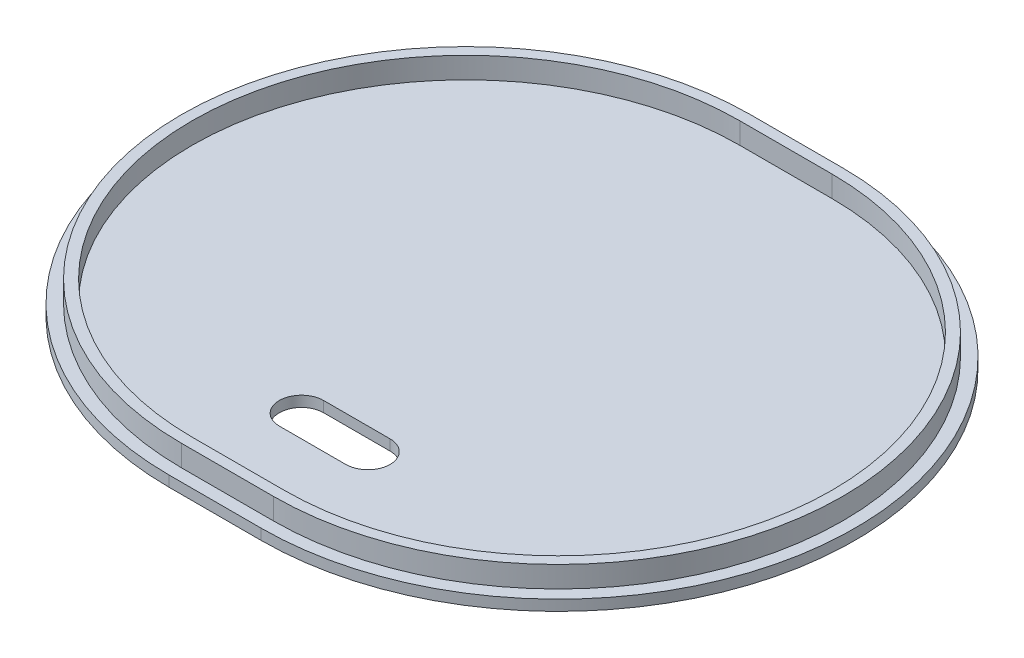
ISO-10303-21;
HEADER;
FILE_DESCRIPTION(('STEP AP214'),'2;1');
FILE_NAME('part.step','',(''),(''),'','','');
FILE_SCHEMA(('AUTOMOTIVE_DESIGN { 1 0 10303 214 1 1 1 1 }'));
ENDSEC;
DATA;
#1=APPLICATION_CONTEXT('core data for automotive mechanical design processes');
#2=APPLICATION_PROTOCOL_DEFINITION('international standard','automotive_design',2000,#1);
#3=PRODUCT_CONTEXT('',#1,'mechanical');
#4=PRODUCT('Part','Part','',(#3));
#5=PRODUCT_RELATED_PRODUCT_CATEGORY('part','',(#4));
#6=PRODUCT_DEFINITION_FORMATION('','',#4);
#7=PRODUCT_DEFINITION_CONTEXT('part definition',#1,'design');
#8=PRODUCT_DEFINITION('design','',#6,#7);
#9=PRODUCT_DEFINITION_SHAPE('','',#8);
#10=(LENGTH_UNIT() NAMED_UNIT(*) SI_UNIT(.MILLI.,.METRE.));
#11=(NAMED_UNIT(*) PLANE_ANGLE_UNIT() SI_UNIT($,.RADIAN.));
#12=(NAMED_UNIT(*) SI_UNIT($,.STERADIAN.) SOLID_ANGLE_UNIT());
#13=UNCERTAINTY_MEASURE_WITH_UNIT(LENGTH_MEASURE(1.E-05),#10,'distance_accuracy_value','');
#14=(GEOMETRIC_REPRESENTATION_CONTEXT(3) GLOBAL_UNCERTAINTY_ASSIGNED_CONTEXT((#13)) GLOBAL_UNIT_ASSIGNED_CONTEXT((#10,
#11,#12)) REPRESENTATION_CONTEXT('',''));
#15=CARTESIAN_POINT('',(0.,0.,0.));
#16=DIRECTION('',(0.,0.,1.));
#17=DIRECTION('',(1.,0.,0.));
#18=AXIS2_PLACEMENT_3D('',#15,#16,#17);
#19=CARTESIAN_POINT('',(10.4,2.4,0.));
#20=DIRECTION('',(0.,1.,0.));
#21=DIRECTION('',(0.,0.,1.));
#22=AXIS2_PLACEMENT_3D('',#19,#20,#21);
#23=PLANE('',#22);
#24=CARTESIAN_POINT('',(10.4,2.4,0.));
#25=DIRECTION('',(0.,1.,0.));
#26=DIRECTION('',(0.,0.,1.));
#27=AXIS2_PLACEMENT_3D('',#24,#25,#26);
#28=CIRCLE('',#27,67.);
#29=CARTESIAN_POINT('',(10.4,2.4,67.));
#30=VERTEX_POINT('',#29);
#31=CARTESIAN_POINT('',(10.4,2.4,-67.));
#32=VERTEX_POINT('',#31);
#33=EDGE_CURVE('E240',#30,#32,#28,.T.);
#34=ORIENTED_EDGE('',*,*,#33,.T.);
#35=DIRECTION('',(-1.,0.,0.));
#36=VECTOR('',#35,1.);
#37=CARTESIAN_POINT('',(-10.4,2.4,-66.9999999999999));
#38=LINE('',#37,#36);
#39=CARTESIAN_POINT('',(-10.4,2.4,-66.9999999999999));
#40=VERTEX_POINT('',#39);
#41=EDGE_CURVE('E243',#32,#40,#38,.T.);
#42=ORIENTED_EDGE('',*,*,#41,.T.);
#43=CARTESIAN_POINT('',(-10.4,2.4,0.));
#44=DIRECTION('',(0.,1.,0.));
#45=DIRECTION('',(0.,0.,-1.));
#46=AXIS2_PLACEMENT_3D('',#43,#44,#45);
#47=CIRCLE('',#46,66.9999999999999);
#48=CARTESIAN_POINT('',(-10.4,2.4,66.9999999999999));
#49=VERTEX_POINT('',#48);
#50=EDGE_CURVE('E246',#40,#49,#47,.T.);
#51=ORIENTED_EDGE('',*,*,#50,.T.);
#52=DIRECTION('',(1.,0.,0.));
#53=VECTOR('',#52,1.);
#54=CARTESIAN_POINT('',(-10.4,2.4,66.9999999999999));
#55=LINE('',#54,#53);
#56=EDGE_CURVE('E248',#49,#30,#55,.T.);
#57=ORIENTED_EDGE('',*,*,#56,.T.);
#58=EDGE_LOOP('',(#34,#42,#51,#57));
#59=FACE_BOUND('',#58,.T.);
#60=DIRECTION('',(1.,0.,0.));
#61=VECTOR('',#60,1.);
#62=CARTESIAN_POINT('',(-10.4,2.4,64.1999999999999));
#63=LINE('',#62,#61);
#64=CARTESIAN_POINT('',(-10.4,2.4,64.1999999999999));
#65=VERTEX_POINT('',#64);
#66=CARTESIAN_POINT('',(10.4,2.4,64.2));
#67=VERTEX_POINT('',#66);
#68=EDGE_CURVE('E224',#65,#67,#63,.T.);
#69=ORIENTED_EDGE('',*,*,#68,.F.);
#70=CARTESIAN_POINT('',(-10.4,2.4,0.));
#71=DIRECTION('',(0.,1.,0.));
#72=DIRECTION('',(0.,0.,-1.));
#73=AXIS2_PLACEMENT_3D('',#70,#71,#72);
#74=CIRCLE('',#73,64.1999999999999);
#75=CARTESIAN_POINT('',(-10.4,2.4,-64.1999999999999));
#76=VERTEX_POINT('',#75);
#77=EDGE_CURVE('E210',#76,#65,#74,.T.);
#78=ORIENTED_EDGE('',*,*,#77,.F.);
#79=DIRECTION('',(-1.,0.,0.));
#80=VECTOR('',#79,1.);
#81=CARTESIAN_POINT('',(-10.4,2.4,-64.1999999999999));
#82=LINE('',#81,#80);
#83=CARTESIAN_POINT('',(10.4,2.4,-64.1999999999999));
#84=VERTEX_POINT('',#83);
#85=EDGE_CURVE('E215',#84,#76,#82,.T.);
#86=ORIENTED_EDGE('',*,*,#85,.F.);
#87=CARTESIAN_POINT('',(10.4,2.4,0.));
#88=DIRECTION('',(0.,1.,0.));
#89=DIRECTION('',(0.,0.,1.));
#90=AXIS2_PLACEMENT_3D('',#87,#88,#89);
#91=CIRCLE('',#90,64.2);
#92=EDGE_CURVE('E226',#67,#84,#91,.T.);
#93=ORIENTED_EDGE('',*,*,#92,.F.);
#94=EDGE_LOOP('',(#69,#78,#86,#93));
#95=FACE_BOUND('',#94,.T.);
#96=ADVANCED_FACE('F32',(#59,#95),#23,.T.);
#97=CARTESIAN_POINT('',(10.4,2.4,0.));
#98=DIRECTION('',(0.,-1.,0.));
#99=DIRECTION('',(0.,0.,-1.));
#100=AXIS2_PLACEMENT_3D('',#97,#98,#99);
#101=CYLINDRICAL_SURFACE('',#100,67.);
#102=CARTESIAN_POINT('',(10.4,0.,0.));
#103=DIRECTION('',(0.,1.,0.));
#104=DIRECTION('',(0.,0.,1.));
#105=AXIS2_PLACEMENT_3D('',#102,#103,#104);
#106=CIRCLE('',#105,67.);
#107=CARTESIAN_POINT('',(10.4,0.,67.));
#108=VERTEX_POINT('',#107);
#109=CARTESIAN_POINT('',(10.4,0.,-67.));
#110=VERTEX_POINT('',#109);
#111=EDGE_CURVE('E239',#108,#110,#106,.T.);
#112=ORIENTED_EDGE('',*,*,#111,.T.);
#113=DIRECTION('',(0.,-1.,0.));
#114=VECTOR('',#113,1.);
#115=CARTESIAN_POINT('',(10.4,2.4,-67.));
#116=LINE('',#115,#114);
#117=EDGE_CURVE('E11',#32,#110,#116,.T.);
#118=ORIENTED_EDGE('',*,*,#117,.F.);
#119=ORIENTED_EDGE('',*,*,#33,.F.);
#120=DIRECTION('',(0.,-1.,0.));
#121=VECTOR('',#120,1.);
#122=CARTESIAN_POINT('',(10.4,2.4,67.));
#123=LINE('',#122,#121);
#124=EDGE_CURVE('E250',#30,#108,#123,.T.);
#125=ORIENTED_EDGE('',*,*,#124,.T.);
#126=EDGE_LOOP('',(#112,#118,#119,#125));
#127=FACE_BOUND('',#126,.T.);
#128=ADVANCED_FACE('F34',(#127),#101,.T.);
#129=CARTESIAN_POINT('',(-10.4,2.4,-66.9999999999999));
#130=DIRECTION('',(0.,0.,1.));
#131=DIRECTION('',(1.,0.,0.));
#132=AXIS2_PLACEMENT_3D('',#129,#130,#131);
#133=PLANE('',#132);
#134=DIRECTION('',(-1.,0.,0.));
#135=VECTOR('',#134,1.);
#136=CARTESIAN_POINT('',(-10.4,0.,-66.9999999999999));
#137=LINE('',#136,#135);
#138=CARTESIAN_POINT('',(-10.4,0.,-66.9999999999999));
#139=VERTEX_POINT('',#138);
#140=EDGE_CURVE('E253',#110,#139,#137,.T.);
#141=ORIENTED_EDGE('',*,*,#140,.T.);
#142=DIRECTION('',(0.,-1.,0.));
#143=VECTOR('',#142,1.);
#144=CARTESIAN_POINT('',(-10.4,2.4,-66.9999999999999));
#145=LINE('',#144,#143);
#146=EDGE_CURVE('E40',#40,#139,#145,.T.);
#147=ORIENTED_EDGE('',*,*,#146,.F.);
#148=ORIENTED_EDGE('',*,*,#41,.F.);
#149=ORIENTED_EDGE('',*,*,#117,.T.);
#150=EDGE_LOOP('',(#141,#147,#148,#149));
#151=FACE_BOUND('',#150,.T.);
#152=ADVANCED_FACE('F281',(#151),#133,.F.);
#153=CARTESIAN_POINT('',(-10.4,2.4,0.));
#154=DIRECTION('',(0.,-1.,0.));
#155=DIRECTION('',(0.,0.,-1.));
#156=AXIS2_PLACEMENT_3D('',#153,#154,#155);
#157=CYLINDRICAL_SURFACE('',#156,66.9999999999999);
#158=CARTESIAN_POINT('',(-10.4,0.,0.));
#159=DIRECTION('',(0.,1.,0.));
#160=DIRECTION('',(0.,0.,-1.));
#161=AXIS2_PLACEMENT_3D('',#158,#159,#160);
#162=CIRCLE('',#161,66.9999999999999);
#163=CARTESIAN_POINT('',(-10.4,0.,66.9999999999999));
#164=VERTEX_POINT('',#163);
#165=EDGE_CURVE('E255',#139,#164,#162,.T.);
#166=ORIENTED_EDGE('',*,*,#165,.T.);
#167=DIRECTION('',(0.,-1.,0.));
#168=VECTOR('',#167,1.);
#169=CARTESIAN_POINT('',(-10.4,2.4,66.9999999999999));
#170=LINE('',#169,#168);
#171=EDGE_CURVE('E260',#49,#164,#170,.T.);
#172=ORIENTED_EDGE('',*,*,#171,.F.);
#173=ORIENTED_EDGE('',*,*,#50,.F.);
#174=ORIENTED_EDGE('',*,*,#146,.T.);
#175=EDGE_LOOP('',(#166,#172,#173,#174));
#176=FACE_BOUND('',#175,.T.);
#177=ADVANCED_FACE('F267',(#176),#157,.T.);
#178=CARTESIAN_POINT('',(-10.4,2.4,66.9999999999999));
#179=DIRECTION('',(0.,0.,-1.));
#180=DIRECTION('',(-1.,0.,0.));
#181=AXIS2_PLACEMENT_3D('',#178,#179,#180);
#182=PLANE('',#181);
#183=DIRECTION('',(1.,0.,0.));
#184=VECTOR('',#183,1.);
#185=CARTESIAN_POINT('',(-10.4,0.,66.9999999999999));
#186=LINE('',#185,#184);
#187=EDGE_CURVE('E244',#164,#108,#186,.T.);
#188=ORIENTED_EDGE('',*,*,#187,.T.);
#189=ORIENTED_EDGE('',*,*,#124,.F.);
#190=ORIENTED_EDGE('',*,*,#56,.F.);
#191=ORIENTED_EDGE('',*,*,#171,.T.);
#192=EDGE_LOOP('',(#188,#189,#190,#191));
#193=FACE_BOUND('',#192,.T.);
#194=ADVANCED_FACE('F274',(#193),#182,.F.);
#195=CARTESIAN_POINT('',(10.4,0.,0.));
#196=DIRECTION('',(0.,1.,0.));
#197=DIRECTION('',(0.,0.,1.));
#198=AXIS2_PLACEMENT_3D('',#195,#196,#197);
#199=PLANE('',#198);
#200=DIRECTION('',(-1.,0.,0.));
#201=VECTOR('',#200,1.);
#202=CARTESIAN_POINT('',(-7.49999999999999,0.,35.));
#203=LINE('',#202,#201);
#204=CARTESIAN_POINT('',(7.5,0.,35.));
#205=VERTEX_POINT('',#204);
#206=CARTESIAN_POINT('',(-7.49999999999999,0.,35.));
#207=VERTEX_POINT('',#206);
#208=EDGE_CURVE('E153',#205,#207,#203,.T.);
#209=ORIENTED_EDGE('',*,*,#208,.T.);
#210=CARTESIAN_POINT('',(-7.49999999999999,0.,40.));
#211=DIRECTION('',(0.,1.,0.));
#212=DIRECTION('',(0.,0.,1.));
#213=AXIS2_PLACEMENT_3D('',#210,#211,#212);
#214=CIRCLE('',#213,4.99999999999999);
#215=CARTESIAN_POINT('',(-7.49999999999999,0.,45.));
#216=VERTEX_POINT('',#215);
#217=EDGE_CURVE('E147',#207,#216,#214,.T.);
#218=ORIENTED_EDGE('',*,*,#217,.T.);
#219=DIRECTION('',(1.,0.,0.));
#220=VECTOR('',#219,1.);
#221=CARTESIAN_POINT('',(-7.49999999999999,0.,45.));
#222=LINE('',#221,#220);
#223=CARTESIAN_POINT('',(7.50000000000001,0.,45.));
#224=VERTEX_POINT('',#223);
#225=EDGE_CURVE('E156',#216,#224,#222,.T.);
#226=ORIENTED_EDGE('',*,*,#225,.T.);
#227=CARTESIAN_POINT('',(7.50000000000001,0.,40.));
#228=DIRECTION('',(0.,1.,0.));
#229=DIRECTION('',(0.,0.,1.));
#230=AXIS2_PLACEMENT_3D('',#227,#228,#229);
#231=CIRCLE('',#230,4.99999999999999);
#232=EDGE_CURVE('E47',#224,#205,#231,.T.);
#233=ORIENTED_EDGE('',*,*,#232,.T.);
#234=EDGE_LOOP('',(#209,#218,#226,#233));
#235=FACE_BOUND('',#234,.T.);
#236=ORIENTED_EDGE('',*,*,#111,.F.);
#237=ORIENTED_EDGE('',*,*,#187,.F.);
#238=ORIENTED_EDGE('',*,*,#165,.F.);
#239=ORIENTED_EDGE('',*,*,#140,.F.);
#240=EDGE_LOOP('',(#236,#237,#238,#239));
#241=FACE_BOUND('',#240,.T.);
#242=ADVANCED_FACE('F160',(#235,#241),#199,.F.);
#243=CARTESIAN_POINT('',(-10.4,7.2,0.));
#244=DIRECTION('',(0.,-1.,0.));
#245=DIRECTION('',(0.,0.,-1.));
#246=AXIS2_PLACEMENT_3D('',#243,#244,#245);
#247=PLANE('',#246);
#248=CARTESIAN_POINT('',(-10.4,7.2,0.));
#249=DIRECTION('',(0.,1.,0.));
#250=DIRECTION('',(0.,0.,-1.));
#251=AXIS2_PLACEMENT_3D('',#248,#249,#250);
#252=CIRCLE('',#251,64.1999999999999);
#253=CARTESIAN_POINT('',(-10.4,7.2,-64.1999999999999));
#254=VERTEX_POINT('',#253);
#255=CARTESIAN_POINT('',(-10.4,7.2,64.1999999999999));
#256=VERTEX_POINT('',#255);
#257=EDGE_CURVE('E211',#254,#256,#252,.T.);
#258=ORIENTED_EDGE('',*,*,#257,.T.);
#259=DIRECTION('',(1.,0.,0.));
#260=VECTOR('',#259,1.);
#261=CARTESIAN_POINT('',(-10.4,7.2,64.1999999999999));
#262=LINE('',#261,#260);
#263=CARTESIAN_POINT('',(10.4,7.2,64.2));
#264=VERTEX_POINT('',#263);
#265=EDGE_CURVE('E214',#256,#264,#262,.T.);
#266=ORIENTED_EDGE('',*,*,#265,.T.);
#267=CARTESIAN_POINT('',(10.4,7.2,0.));
#268=DIRECTION('',(0.,1.,0.));
#269=DIRECTION('',(0.,0.,1.));
#270=AXIS2_PLACEMENT_3D('',#267,#268,#269);
#271=CIRCLE('',#270,64.2);
#272=CARTESIAN_POINT('',(10.4,7.2,-64.2));
#273=VERTEX_POINT('',#272);
#274=EDGE_CURVE('E217',#264,#273,#271,.T.);
#275=ORIENTED_EDGE('',*,*,#274,.T.);
#276=DIRECTION('',(-1.,0.,0.));
#277=VECTOR('',#276,1.);
#278=CARTESIAN_POINT('',(-10.4,7.2,-64.1999999999999));
#279=LINE('',#278,#277);
#280=EDGE_CURVE('E219',#273,#254,#279,.T.);
#281=ORIENTED_EDGE('',*,*,#280,.T.);
#282=EDGE_LOOP('',(#258,#266,#275,#281));
#283=FACE_BOUND('',#282,.T.);
#284=CARTESIAN_POINT('',(-10.4,7.2,0.));
#285=DIRECTION('',(0.,1.,0.));
#286=DIRECTION('',(0.,0.,-1.));
#287=AXIS2_PLACEMENT_3D('',#284,#285,#286);
#288=CIRCLE('',#287,61.8);
#289=CARTESIAN_POINT('',(-10.4,7.2,-61.8));
#290=VERTEX_POINT('',#289);
#291=CARTESIAN_POINT('',(-10.4,7.2,61.8));
#292=VERTEX_POINT('',#291);
#293=EDGE_CURVE('E182',#290,#292,#288,.T.);
#294=ORIENTED_EDGE('',*,*,#293,.F.);
#295=DIRECTION('',(-1.,0.,0.));
#296=VECTOR('',#295,1.);
#297=CARTESIAN_POINT('',(-10.4,7.2,-61.8));
#298=LINE('',#297,#296);
#299=CARTESIAN_POINT('',(10.4,7.2,-61.8));
#300=VERTEX_POINT('',#299);
#301=EDGE_CURVE('E190',#300,#290,#298,.T.);
#302=ORIENTED_EDGE('',*,*,#301,.F.);
#303=CARTESIAN_POINT('',(10.4,7.2,0.));
#304=DIRECTION('',(0.,1.,0.));
#305=DIRECTION('',(0.,0.,1.));
#306=AXIS2_PLACEMENT_3D('',#303,#304,#305);
#307=CIRCLE('',#306,61.8);
#308=CARTESIAN_POINT('',(10.4,7.2,61.8));
#309=VERTEX_POINT('',#308);
#310=EDGE_CURVE('E187',#309,#300,#307,.T.);
#311=ORIENTED_EDGE('',*,*,#310,.F.);
#312=DIRECTION('',(1.,0.,0.));
#313=VECTOR('',#312,1.);
#314=CARTESIAN_POINT('',(-10.4,7.2,61.8));
#315=LINE('',#314,#313);
#316=EDGE_CURVE('E184',#292,#309,#315,.T.);
#317=ORIENTED_EDGE('',*,*,#316,.F.);
#318=EDGE_LOOP('',(#294,#302,#311,#317));
#319=FACE_BOUND('',#318,.T.);
#320=ADVANCED_FACE('F324',(#283,#319),#247,.F.);
#321=CARTESIAN_POINT('',(-10.4,7.2,0.));
#322=DIRECTION('',(0.,-1.,0.));
#323=DIRECTION('',(0.,0.,-1.));
#324=AXIS2_PLACEMENT_3D('',#321,#322,#323);
#325=CYLINDRICAL_SURFACE('',#324,64.1999999999999);
#326=ORIENTED_EDGE('',*,*,#77,.T.);
#327=DIRECTION('',(0.,-1.,0.));
#328=VECTOR('',#327,1.);
#329=CARTESIAN_POINT('',(-10.4,7.2,64.1999999999999));
#330=LINE('',#329,#328);
#331=EDGE_CURVE('E237',#256,#65,#330,.T.);
#332=ORIENTED_EDGE('',*,*,#331,.F.);
#333=ORIENTED_EDGE('',*,*,#257,.F.);
#334=DIRECTION('',(0.,-1.,0.));
#335=VECTOR('',#334,1.);
#336=CARTESIAN_POINT('',(-10.4,7.2,-64.1999999999999));
#337=LINE('',#336,#335);
#338=EDGE_CURVE('E221',#254,#76,#337,.T.);
#339=ORIENTED_EDGE('',*,*,#338,.T.);
#340=EDGE_LOOP('',(#326,#332,#333,#339));
#341=FACE_BOUND('',#340,.T.);
#342=ADVANCED_FACE('F339',(#341),#325,.T.);
#343=CARTESIAN_POINT('',(-10.4,7.2,64.1999999999999));
#344=DIRECTION('',(0.,0.,-1.));
#345=DIRECTION('',(-1.,0.,0.));
#346=AXIS2_PLACEMENT_3D('',#343,#344,#345);
#347=PLANE('',#346);
#348=ORIENTED_EDGE('',*,*,#68,.T.);
#349=DIRECTION('',(0.,-1.,0.));
#350=VECTOR('',#349,1.);
#351=CARTESIAN_POINT('',(10.4,7.2,64.2));
#352=LINE('',#351,#350);
#353=EDGE_CURVE('E234',#264,#67,#352,.T.);
#354=ORIENTED_EDGE('',*,*,#353,.F.);
#355=ORIENTED_EDGE('',*,*,#265,.F.);
#356=ORIENTED_EDGE('',*,*,#331,.T.);
#357=EDGE_LOOP('',(#348,#354,#355,#356));
#358=FACE_BOUND('',#357,.T.);
#359=ADVANCED_FACE('F347',(#358),#347,.F.);
#360=CARTESIAN_POINT('',(10.4,7.2,0.));
#361=DIRECTION('',(0.,-1.,0.));
#362=DIRECTION('',(0.,0.,-1.));
#363=AXIS2_PLACEMENT_3D('',#360,#361,#362);
#364=CYLINDRICAL_SURFACE('',#363,64.2);
#365=ORIENTED_EDGE('',*,*,#92,.T.);
#366=DIRECTION('',(0.,-1.,0.));
#367=VECTOR('',#366,1.);
#368=CARTESIAN_POINT('',(10.4,7.2,-64.2));
#369=LINE('',#368,#367);
#370=EDGE_CURVE('E232',#273,#84,#369,.T.);
#371=ORIENTED_EDGE('',*,*,#370,.F.);
#372=ORIENTED_EDGE('',*,*,#274,.F.);
#373=ORIENTED_EDGE('',*,*,#353,.T.);
#374=EDGE_LOOP('',(#365,#371,#372,#373));
#375=FACE_BOUND('',#374,.T.);
#376=ADVANCED_FACE('F343',(#375),#364,.T.);
#377=CARTESIAN_POINT('',(-10.4,7.2,-64.1999999999999));
#378=DIRECTION('',(0.,0.,1.));
#379=DIRECTION('',(1.,0.,0.));
#380=AXIS2_PLACEMENT_3D('',#377,#378,#379);
#381=PLANE('',#380);
#382=ORIENTED_EDGE('',*,*,#85,.T.);
#383=ORIENTED_EDGE('',*,*,#338,.F.);
#384=ORIENTED_EDGE('',*,*,#280,.F.);
#385=ORIENTED_EDGE('',*,*,#370,.T.);
#386=EDGE_LOOP('',(#382,#383,#384,#385));
#387=FACE_BOUND('',#386,.T.);
#388=ADVANCED_FACE('F336',(#387),#381,.F.);
#389=CARTESIAN_POINT('',(-10.4,7.2,0.));
#390=DIRECTION('',(0.,-1.,0.));
#391=DIRECTION('',(0.,0.,-1.));
#392=AXIS2_PLACEMENT_3D('',#389,#390,#391);
#393=CYLINDRICAL_SURFACE('',#392,61.8);
#394=CARTESIAN_POINT('',(-10.4,2.4,0.));
#395=DIRECTION('',(0.,1.,0.));
#396=DIRECTION('',(0.,0.,-1.));
#397=AXIS2_PLACEMENT_3D('',#394,#395,#396);
#398=CIRCLE('',#397,61.8);
#399=CARTESIAN_POINT('',(-10.4,2.4,-61.8));
#400=VERTEX_POINT('',#399);
#401=CARTESIAN_POINT('',(-10.4,2.4,61.8));
#402=VERTEX_POINT('',#401);
#403=EDGE_CURVE('E178',#400,#402,#398,.T.);
#404=ORIENTED_EDGE('',*,*,#403,.F.);
#405=DIRECTION('',(0.,-1.,0.));
#406=VECTOR('',#405,1.);
#407=CARTESIAN_POINT('',(-10.4,7.2,-61.8));
#408=LINE('',#407,#406);
#409=EDGE_CURVE('E192',#290,#400,#408,.T.);
#410=ORIENTED_EDGE('',*,*,#409,.F.);
#411=ORIENTED_EDGE('',*,*,#293,.T.);
#412=DIRECTION('',(0.,-1.,0.));
#413=VECTOR('',#412,1.);
#414=CARTESIAN_POINT('',(-10.4,7.2,61.8));
#415=LINE('',#414,#413);
#416=EDGE_CURVE('E207',#292,#402,#415,.T.);
#417=ORIENTED_EDGE('',*,*,#416,.T.);
#418=EDGE_LOOP('',(#404,#410,#411,#417));
#419=FACE_BOUND('',#418,.T.);
#420=ADVANCED_FACE('F320',(#419),#393,.F.);
#421=CARTESIAN_POINT('',(-10.4,7.2,61.8));
#422=DIRECTION('',(0.,0.,-1.));
#423=DIRECTION('',(-1.,0.,0.));
#424=AXIS2_PLACEMENT_3D('',#421,#422,#423);
#425=PLANE('',#424);
#426=DIRECTION('',(1.,0.,0.));
#427=VECTOR('',#426,1.);
#428=CARTESIAN_POINT('',(-10.4,2.4,61.8));
#429=LINE('',#428,#427);
#430=CARTESIAN_POINT('',(10.4,2.4,61.8));
#431=VERTEX_POINT('',#430);
#432=EDGE_CURVE('E194',#402,#431,#429,.T.);
#433=ORIENTED_EDGE('',*,*,#432,.F.);
#434=ORIENTED_EDGE('',*,*,#416,.F.);
#435=ORIENTED_EDGE('',*,*,#316,.T.);
#436=DIRECTION('',(0.,-1.,0.));
#437=VECTOR('',#436,1.);
#438=CARTESIAN_POINT('',(10.4,7.2,61.8));
#439=LINE('',#438,#437);
#440=EDGE_CURVE('E204',#309,#431,#439,.T.);
#441=ORIENTED_EDGE('',*,*,#440,.T.);
#442=EDGE_LOOP('',(#433,#434,#435,#441));
#443=FACE_BOUND('',#442,.T.);
#444=ADVANCED_FACE('F316',(#443),#425,.T.);
#445=CARTESIAN_POINT('',(10.4,7.2,0.));
#446=DIRECTION('',(0.,-1.,0.));
#447=DIRECTION('',(0.,0.,-1.));
#448=AXIS2_PLACEMENT_3D('',#445,#446,#447);
#449=CYLINDRICAL_SURFACE('',#448,61.8);
#450=CARTESIAN_POINT('',(10.4,2.4,0.));
#451=DIRECTION('',(0.,1.,0.));
#452=DIRECTION('',(0.,0.,1.));
#453=AXIS2_PLACEMENT_3D('',#450,#451,#452);
#454=CIRCLE('',#453,61.8);
#455=CARTESIAN_POINT('',(10.4,2.4,-61.8));
#456=VERTEX_POINT('',#455);
#457=EDGE_CURVE('E196',#431,#456,#454,.T.);
#458=ORIENTED_EDGE('',*,*,#457,.F.);
#459=ORIENTED_EDGE('',*,*,#440,.F.);
#460=ORIENTED_EDGE('',*,*,#310,.T.);
#461=DIRECTION('',(0.,-1.,0.));
#462=VECTOR('',#461,1.);
#463=CARTESIAN_POINT('',(10.4,7.2,-61.8));
#464=LINE('',#463,#462);
#465=EDGE_CURVE('E201',#300,#456,#464,.T.);
#466=ORIENTED_EDGE('',*,*,#465,.T.);
#467=EDGE_LOOP('',(#458,#459,#460,#466));
#468=FACE_BOUND('',#467,.T.);
#469=ADVANCED_FACE('F304',(#468),#449,.F.);
#470=CARTESIAN_POINT('',(-10.4,7.2,-61.8));
#471=DIRECTION('',(0.,0.,1.));
#472=DIRECTION('',(1.,0.,0.));
#473=AXIS2_PLACEMENT_3D('',#470,#471,#472);
#474=PLANE('',#473);
#475=DIRECTION('',(-1.,0.,0.));
#476=VECTOR('',#475,1.);
#477=CARTESIAN_POINT('',(-10.4,2.4,-61.8));
#478=LINE('',#477,#476);
#479=EDGE_CURVE('E185',#456,#400,#478,.T.);
#480=ORIENTED_EDGE('',*,*,#479,.F.);
#481=ORIENTED_EDGE('',*,*,#465,.F.);
#482=ORIENTED_EDGE('',*,*,#301,.T.);
#483=ORIENTED_EDGE('',*,*,#409,.T.);
#484=EDGE_LOOP('',(#480,#481,#482,#483));
#485=FACE_BOUND('',#484,.T.);
#486=ADVANCED_FACE('F296',(#485),#474,.T.);
#487=CARTESIAN_POINT('',(-7.49999999999999,2.4,40.));
#488=DIRECTION('',(0.,1.,0.));
#489=DIRECTION('',(0.,0.,1.));
#490=AXIS2_PLACEMENT_3D('',#487,#488,#489);
#491=CIRCLE('',#490,4.99999999999999);
#492=CARTESIAN_POINT('',(-7.49999999999999,2.4,35.));
#493=VERTEX_POINT('',#492);
#494=CARTESIAN_POINT('',(-7.49999999999999,2.4,45.));
#495=VERTEX_POINT('',#494);
#496=EDGE_CURVE('E55',#493,#495,#491,.T.);
#497=ORIENTED_EDGE('',*,*,#496,.F.);
#498=DIRECTION('',(-1.,0.,0.));
#499=VECTOR('',#498,1.);
#500=CARTESIAN_POINT('',(-7.49999999999999,2.4,35.));
#501=LINE('',#500,#499);
#502=CARTESIAN_POINT('',(7.5,2.4,35.));
#503=VERTEX_POINT('',#502);
#504=EDGE_CURVE('E163',#503,#493,#501,.T.);
#505=ORIENTED_EDGE('',*,*,#504,.F.);
#506=CARTESIAN_POINT('',(7.50000000000001,2.4,40.));
#507=DIRECTION('',(0.,1.,0.));
#508=DIRECTION('',(0.,0.,1.));
#509=AXIS2_PLACEMENT_3D('',#506,#507,#508);
#510=CIRCLE('',#509,4.99999999999999);
#511=CARTESIAN_POINT('',(7.50000000000001,2.4,45.));
#512=VERTEX_POINT('',#511);
#513=EDGE_CURVE('E166',#512,#503,#510,.T.);
#514=ORIENTED_EDGE('',*,*,#513,.F.);
#515=DIRECTION('',(1.,0.,0.));
#516=VECTOR('',#515,1.);
#517=CARTESIAN_POINT('',(-7.49999999999999,2.4,45.));
#518=LINE('',#517,#516);
#519=EDGE_CURVE('E172',#495,#512,#518,.T.);
#520=ORIENTED_EDGE('',*,*,#519,.F.);
#521=EDGE_LOOP('',(#497,#505,#514,#520));
#522=FACE_BOUND('',#521,.T.);
#523=ORIENTED_EDGE('',*,*,#403,.T.);
#524=ORIENTED_EDGE('',*,*,#432,.T.);
#525=ORIENTED_EDGE('',*,*,#457,.T.);
#526=ORIENTED_EDGE('',*,*,#479,.T.);
#527=EDGE_LOOP('',(#523,#524,#525,#526));
#528=FACE_BOUND('',#527,.T.);
#529=ADVANCED_FACE('F290',(#522,#528),#23,.T.);
#530=CARTESIAN_POINT('',(-7.49999999999999,0.,40.));
#531=DIRECTION('',(0.,1.,0.));
#532=DIRECTION('',(0.,0.,1.));
#533=AXIS2_PLACEMENT_3D('',#530,#531,#532);
#534=CYLINDRICAL_SURFACE('',#533,4.99999999999999);
#535=ORIENTED_EDGE('',*,*,#496,.T.);
#536=DIRECTION('',(0.,1.,0.));
#537=VECTOR('',#536,1.);
#538=CARTESIAN_POINT('',(-7.49999999999999,0.,45.));
#539=LINE('',#538,#537);
#540=EDGE_CURVE('E143',#216,#495,#539,.T.);
#541=ORIENTED_EDGE('',*,*,#540,.F.);
#542=ORIENTED_EDGE('',*,*,#217,.F.);
#543=DIRECTION('',(0.,1.,0.));
#544=VECTOR('',#543,1.);
#545=CARTESIAN_POINT('',(-7.49999999999999,0.,35.));
#546=LINE('',#545,#544);
#547=EDGE_CURVE('E176',#207,#493,#546,.T.);
#548=ORIENTED_EDGE('',*,*,#547,.T.);
#549=EDGE_LOOP('',(#535,#541,#542,#548));
#550=FACE_BOUND('',#549,.T.);
#551=ADVANCED_FACE('F145',(#550),#534,.F.);
#552=CARTESIAN_POINT('',(-7.49999999999999,0.,35.));
#553=DIRECTION('',(0.,0.,-1.));
#554=DIRECTION('',(-1.,0.,0.));
#555=AXIS2_PLACEMENT_3D('',#552,#553,#554);
#556=PLANE('',#555);
#557=ORIENTED_EDGE('',*,*,#504,.T.);
#558=ORIENTED_EDGE('',*,*,#547,.F.);
#559=ORIENTED_EDGE('',*,*,#208,.F.);
#560=DIRECTION('',(0.,1.,0.));
#561=VECTOR('',#560,1.);
#562=CARTESIAN_POINT('',(7.5,0.,35.));
#563=LINE('',#562,#561);
#564=EDGE_CURVE('E179',#205,#503,#563,.T.);
#565=ORIENTED_EDGE('',*,*,#564,.T.);
#566=EDGE_LOOP('',(#557,#558,#559,#565));
#567=FACE_BOUND('',#566,.T.);
#568=ADVANCED_FACE('F302',(#567),#556,.F.);
#569=CARTESIAN_POINT('',(7.50000000000001,0.,40.));
#570=DIRECTION('',(0.,1.,0.));
#571=DIRECTION('',(0.,0.,1.));
#572=AXIS2_PLACEMENT_3D('',#569,#570,#571);
#573=CYLINDRICAL_SURFACE('',#572,4.99999999999999);
#574=ORIENTED_EDGE('',*,*,#513,.T.);
#575=ORIENTED_EDGE('',*,*,#564,.F.);
#576=ORIENTED_EDGE('',*,*,#232,.F.);
#577=DIRECTION('',(0.,1.,0.));
#578=VECTOR('',#577,1.);
#579=CARTESIAN_POINT('',(7.50000000000001,0.,45.));
#580=LINE('',#579,#578);
#581=EDGE_CURVE('E152',#224,#512,#580,.T.);
#582=ORIENTED_EDGE('',*,*,#581,.T.);
#583=EDGE_LOOP('',(#574,#575,#576,#582));
#584=FACE_BOUND('',#583,.T.);
#585=ADVANCED_FACE('F427',(#584),#573,.F.);
#586=CARTESIAN_POINT('',(-7.49999999999999,0.,45.));
#587=DIRECTION('',(0.,0.,1.));
#588=DIRECTION('',(1.,0.,0.));
#589=AXIS2_PLACEMENT_3D('',#586,#587,#588);
#590=PLANE('',#589);
#591=ORIENTED_EDGE('',*,*,#519,.T.);
#592=ORIENTED_EDGE('',*,*,#581,.F.);
#593=ORIENTED_EDGE('',*,*,#225,.F.);
#594=ORIENTED_EDGE('',*,*,#540,.T.);
#595=EDGE_LOOP('',(#591,#592,#593,#594));
#596=FACE_BOUND('',#595,.T.);
#597=ADVANCED_FACE('F157',(#596),#590,.F.);
#598=CLOSED_SHELL('',(#96,#128,#152,#177,#194,#242,#320,#342,#359,#376,#388,#420,#444,#469,#486,
#529,#551,#568,#585,#597));
#599=MANIFOLD_SOLID_BREP('B2',#598);
#600=ADVANCED_BREP_SHAPE_REPRESENTATION('',(#18,#599),#14);
#601=SHAPE_DEFINITION_REPRESENTATION(#9,#600);
ENDSEC;
END-ISO-10303-21;
